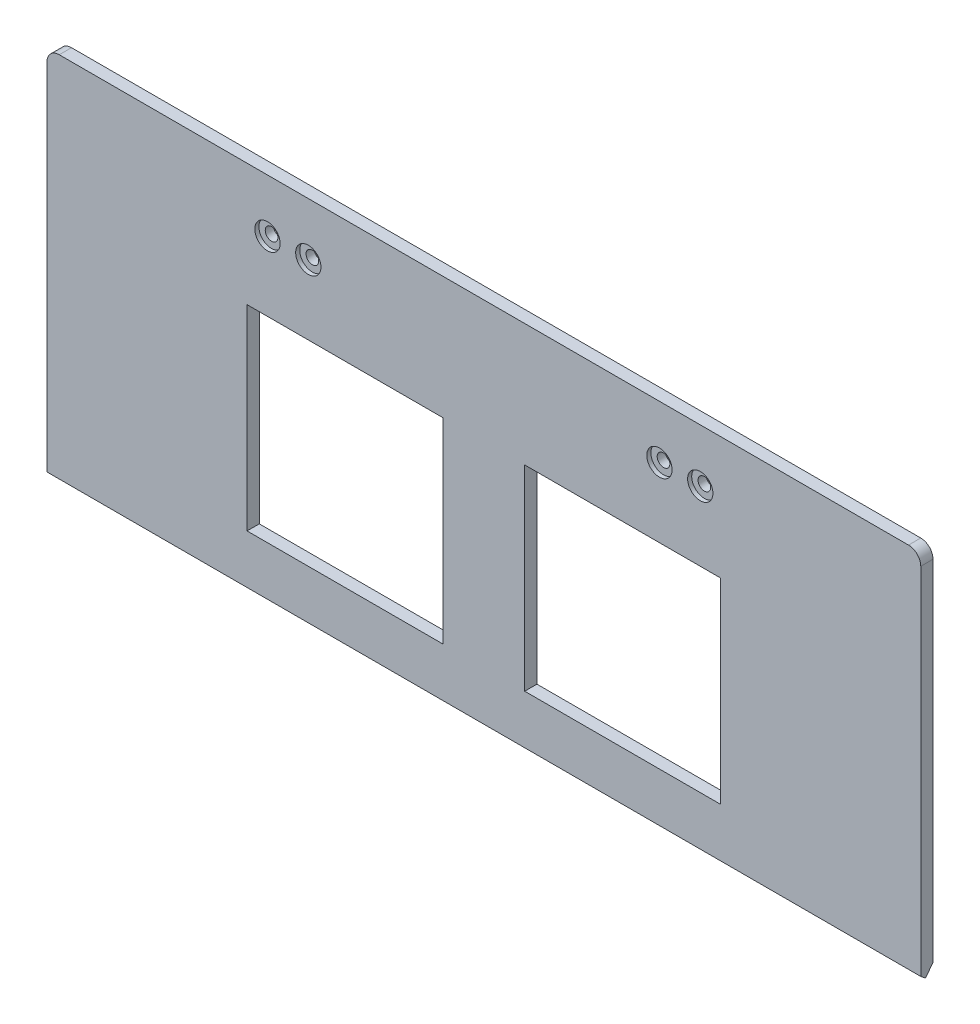
ISO-10303-21;
HEADER;
FILE_DESCRIPTION(('STEP AP214'),'2;1');
FILE_NAME('part.step','',(''),(''),'','','');
FILE_SCHEMA(('AUTOMOTIVE_DESIGN { 1 0 10303 214 1 1 1 1 }'));
ENDSEC;
DATA;
#1=APPLICATION_CONTEXT('core data for automotive mechanical design processes');
#2=APPLICATION_PROTOCOL_DEFINITION('international standard','automotive_design',2000,#1);
#3=PRODUCT_CONTEXT('',#1,'mechanical');
#4=PRODUCT('Part','Part','',(#3));
#5=PRODUCT_RELATED_PRODUCT_CATEGORY('part','',(#4));
#6=PRODUCT_DEFINITION_FORMATION('','',#4);
#7=PRODUCT_DEFINITION_CONTEXT('part definition',#1,'design');
#8=PRODUCT_DEFINITION('design','',#6,#7);
#9=PRODUCT_DEFINITION_SHAPE('','',#8);
#10=(LENGTH_UNIT() NAMED_UNIT(*) SI_UNIT(.MILLI.,.METRE.));
#11=(NAMED_UNIT(*) PLANE_ANGLE_UNIT() SI_UNIT($,.RADIAN.));
#12=(NAMED_UNIT(*) SI_UNIT($,.STERADIAN.) SOLID_ANGLE_UNIT());
#13=UNCERTAINTY_MEASURE_WITH_UNIT(LENGTH_MEASURE(1.E-05),#10,'distance_accuracy_value','');
#14=(GEOMETRIC_REPRESENTATION_CONTEXT(3) GLOBAL_UNCERTAINTY_ASSIGNED_CONTEXT((#13)) GLOBAL_UNIT_ASSIGNED_CONTEXT((#10,
#11,#12)) REPRESENTATION_CONTEXT('',''));
#15=CARTESIAN_POINT('',(0.,0.,0.));
#16=DIRECTION('',(0.,0.,1.));
#17=DIRECTION('',(1.,0.,0.));
#18=AXIS2_PLACEMENT_3D('',#15,#16,#17);
#19=CARTESIAN_POINT('',(104.,42.,-3.));
#20=DIRECTION('',(0.,0.,-1.));
#21=DIRECTION('',(-1.,0.,0.));
#22=AXIS2_PLACEMENT_3D('',#19,#20,#21);
#23=CYLINDRICAL_SURFACE('',#22,3.);
#24=DIRECTION('',(0.,0.,-1.));
#25=VECTOR('',#24,1.);
#26=CARTESIAN_POINT('',(104.,45.,-3.));
#27=LINE('',#26,#25);
#28=CARTESIAN_POINT('',(104.,45.,0.));
#29=VERTEX_POINT('',#28);
#30=CARTESIAN_POINT('',(104.,45.,-3.));
#31=VERTEX_POINT('',#30);
#32=EDGE_CURVE('E373',#29,#31,#27,.T.);
#33=ORIENTED_EDGE('',*,*,#32,.F.);
#34=CARTESIAN_POINT('',(104.,42.,0.));
#35=DIRECTION('',(0.,0.,1.));
#36=DIRECTION('',(1.,0.,0.));
#37=AXIS2_PLACEMENT_3D('',#34,#35,#36);
#38=CIRCLE('',#37,3.);
#39=CARTESIAN_POINT('',(107.,42.,0.));
#40=VERTEX_POINT('',#39);
#41=EDGE_CURVE('E50',#40,#29,#38,.T.);
#42=ORIENTED_EDGE('',*,*,#41,.F.);
#43=DIRECTION('',(0.,0.,-1.));
#44=VECTOR('',#43,1.);
#45=CARTESIAN_POINT('',(107.,42.,-3.));
#46=LINE('',#45,#44);
#47=CARTESIAN_POINT('',(107.,42.,-3.));
#48=VERTEX_POINT('',#47);
#49=EDGE_CURVE('E376',#48,#40,#46,.F.);
#50=ORIENTED_EDGE('',*,*,#49,.F.);
#51=CARTESIAN_POINT('',(104.,42.,-3.));
#52=DIRECTION('',(0.,0.,1.));
#53=DIRECTION('',(1.,0.,0.));
#54=AXIS2_PLACEMENT_3D('',#51,#52,#53);
#55=CIRCLE('',#54,3.);
#56=EDGE_CURVE('E11',#31,#48,#55,.F.);
#57=ORIENTED_EDGE('',*,*,#56,.F.);
#58=EDGE_LOOP('',(#33,#42,#50,#57));
#59=FACE_BOUND('',#58,.T.);
#60=ADVANCED_FACE('F43',(#59),#23,.T.);
#61=CARTESIAN_POINT('',(-104.,42.,-3.));
#62=DIRECTION('',(0.,0.,1.));
#63=DIRECTION('',(1.,0.,0.));
#64=AXIS2_PLACEMENT_3D('',#61,#62,#63);
#65=CYLINDRICAL_SURFACE('',#64,3.);
#66=DIRECTION('',(0.,0.,1.));
#67=VECTOR('',#66,1.);
#68=CARTESIAN_POINT('',(-104.,45.,-3.));
#69=LINE('',#68,#67);
#70=CARTESIAN_POINT('',(-104.,45.,-3.));
#71=VERTEX_POINT('',#70);
#72=CARTESIAN_POINT('',(-104.,45.,0.));
#73=VERTEX_POINT('',#72);
#74=EDGE_CURVE('E330',#71,#73,#69,.T.);
#75=ORIENTED_EDGE('',*,*,#74,.F.);
#76=CARTESIAN_POINT('',(-104.,42.,-3.));
#77=DIRECTION('',(0.,0.,1.));
#78=DIRECTION('',(1.,0.,0.));
#79=AXIS2_PLACEMENT_3D('',#76,#77,#78);
#80=CIRCLE('',#79,3.);
#81=CARTESIAN_POINT('',(-107.,42.,-3.));
#82=VERTEX_POINT('',#81);
#83=EDGE_CURVE('E368',#82,#71,#80,.F.);
#84=ORIENTED_EDGE('',*,*,#83,.F.);
#85=DIRECTION('',(0.,0.,1.));
#86=VECTOR('',#85,1.);
#87=CARTESIAN_POINT('',(-107.,42.,-3.));
#88=LINE('',#87,#86);
#89=CARTESIAN_POINT('',(-107.,42.,0.));
#90=VERTEX_POINT('',#89);
#91=EDGE_CURVE('E365',#90,#82,#88,.F.);
#92=ORIENTED_EDGE('',*,*,#91,.F.);
#93=CARTESIAN_POINT('',(-104.,42.,0.));
#94=DIRECTION('',(0.,0.,1.));
#95=DIRECTION('',(1.,0.,0.));
#96=AXIS2_PLACEMENT_3D('',#93,#94,#95);
#97=CIRCLE('',#96,3.);
#98=EDGE_CURVE('E371',#73,#90,#97,.T.);
#99=ORIENTED_EDGE('',*,*,#98,.F.);
#100=EDGE_LOOP('',(#75,#84,#92,#99));
#101=FACE_BOUND('',#100,.T.);
#102=ADVANCED_FACE('F386',(#101),#65,.T.);
#103=CARTESIAN_POINT('',(-53.,31.9999999999999,0.));
#104=DIRECTION('',(0.,0.,-1.));
#105=DIRECTION('',(-1.,0.,0.));
#106=AXIS2_PLACEMENT_3D('',#103,#104,#105);
#107=CYLINDRICAL_SURFACE('',#106,1.55);
#108=CARTESIAN_POINT('',(-53.,31.9999999999999,-3.));
#109=DIRECTION('',(0.,0.,-1.));
#110=DIRECTION('',(-1.,0.,0.));
#111=AXIS2_PLACEMENT_3D('',#108,#109,#110);
#112=CIRCLE('',#111,1.55);
#113=CARTESIAN_POINT('',(-54.55,31.9999999999999,-3.));
#114=VERTEX_POINT('',#113);
#115=EDGE_CURVE('E318',#114,#114,#112,.T.);
#116=ORIENTED_EDGE('',*,*,#115,.T.);
#117=EDGE_LOOP('',(#116));
#118=FACE_BOUND('',#117,.T.);
#119=CARTESIAN_POINT('',(-53.,31.9999999999999,-1.));
#120=DIRECTION('',(0.,0.,1.));
#121=DIRECTION('',(1.,0.,0.));
#122=AXIS2_PLACEMENT_3D('',#119,#120,#121);
#123=CIRCLE('',#122,1.55);
#124=CARTESIAN_POINT('',(-51.45,31.9999999999999,-1.));
#125=VERTEX_POINT('',#124);
#126=EDGE_CURVE('E321',#125,#125,#123,.F.);
#127=ORIENTED_EDGE('',*,*,#126,.F.);
#128=EDGE_LOOP('',(#127));
#129=FACE_BOUND('',#128,.T.);
#130=ADVANCED_FACE('F454',(#118,#129),#107,.F.);
#131=CARTESIAN_POINT('',(-43.,31.9999999999999,0.));
#132=DIRECTION('',(0.,0.,-1.));
#133=DIRECTION('',(-1.,0.,0.));
#134=AXIS2_PLACEMENT_3D('',#131,#132,#133);
#135=CYLINDRICAL_SURFACE('',#134,1.55);
#136=CARTESIAN_POINT('',(-43.,31.9999999999999,-3.));
#137=DIRECTION('',(0.,0.,-1.));
#138=DIRECTION('',(-1.,0.,0.));
#139=AXIS2_PLACEMENT_3D('',#136,#137,#138);
#140=CIRCLE('',#139,1.55);
#141=CARTESIAN_POINT('',(-44.55,31.9999999999999,-3.));
#142=VERTEX_POINT('',#141);
#143=EDGE_CURVE('E315',#142,#142,#140,.T.);
#144=ORIENTED_EDGE('',*,*,#143,.T.);
#145=EDGE_LOOP('',(#144));
#146=FACE_BOUND('',#145,.T.);
#147=CARTESIAN_POINT('',(-43.,31.9999999999999,-1.));
#148=DIRECTION('',(0.,0.,1.));
#149=DIRECTION('',(1.,0.,0.));
#150=AXIS2_PLACEMENT_3D('',#147,#148,#149);
#151=CIRCLE('',#150,1.55);
#152=CARTESIAN_POINT('',(-41.45,31.9999999999999,-1.));
#153=VERTEX_POINT('',#152);
#154=EDGE_CURVE('E343',#153,#153,#151,.F.);
#155=ORIENTED_EDGE('',*,*,#154,.F.);
#156=EDGE_LOOP('',(#155));
#157=FACE_BOUND('',#156,.T.);
#158=ADVANCED_FACE('F459',(#146,#157),#135,.F.);
#159=CARTESIAN_POINT('',(43.,31.9999999999999,0.));
#160=DIRECTION('',(0.,0.,-1.));
#161=DIRECTION('',(-1.,0.,0.));
#162=AXIS2_PLACEMENT_3D('',#159,#160,#161);
#163=CYLINDRICAL_SURFACE('',#162,1.55);
#164=CARTESIAN_POINT('',(43.,31.9999999999999,-3.));
#165=DIRECTION('',(0.,0.,-1.));
#166=DIRECTION('',(-1.,0.,0.));
#167=AXIS2_PLACEMENT_3D('',#164,#165,#166);
#168=CIRCLE('',#167,1.55);
#169=CARTESIAN_POINT('',(41.45,31.9999999999999,-3.));
#170=VERTEX_POINT('',#169);
#171=EDGE_CURVE('E312',#170,#170,#168,.T.);
#172=ORIENTED_EDGE('',*,*,#171,.T.);
#173=EDGE_LOOP('',(#172));
#174=FACE_BOUND('',#173,.T.);
#175=CARTESIAN_POINT('',(43.,31.9999999999999,-1.));
#176=DIRECTION('',(0.,0.,1.));
#177=DIRECTION('',(1.,0.,0.));
#178=AXIS2_PLACEMENT_3D('',#175,#176,#177);
#179=CIRCLE('',#178,1.55);
#180=CARTESIAN_POINT('',(44.55,31.9999999999999,-1.));
#181=VERTEX_POINT('',#180);
#182=EDGE_CURVE('E340',#181,#181,#179,.F.);
#183=ORIENTED_EDGE('',*,*,#182,.F.);
#184=EDGE_LOOP('',(#183));
#185=FACE_BOUND('',#184,.T.);
#186=ADVANCED_FACE('F479',(#174,#185),#163,.F.);
#187=CARTESIAN_POINT('',(53.,31.9999999999999,0.));
#188=DIRECTION('',(0.,0.,-1.));
#189=DIRECTION('',(-1.,0.,0.));
#190=AXIS2_PLACEMENT_3D('',#187,#188,#189);
#191=CYLINDRICAL_SURFACE('',#190,1.55);
#192=CARTESIAN_POINT('',(53.,31.9999999999999,-3.));
#193=DIRECTION('',(0.,0.,-1.));
#194=DIRECTION('',(-1.,0.,0.));
#195=AXIS2_PLACEMENT_3D('',#192,#193,#194);
#196=CIRCLE('',#195,1.55);
#197=CARTESIAN_POINT('',(51.45,31.9999999999999,-3.));
#198=VERTEX_POINT('',#197);
#199=EDGE_CURVE('E308',#198,#198,#196,.T.);
#200=ORIENTED_EDGE('',*,*,#199,.T.);
#201=EDGE_LOOP('',(#200));
#202=FACE_BOUND('',#201,.T.);
#203=CARTESIAN_POINT('',(53.,31.9999999999999,-1.));
#204=DIRECTION('',(0.,0.,1.));
#205=DIRECTION('',(1.,0.,0.));
#206=AXIS2_PLACEMENT_3D('',#203,#204,#205);
#207=CIRCLE('',#206,1.55);
#208=CARTESIAN_POINT('',(54.55,31.9999999999999,-1.));
#209=VERTEX_POINT('',#208);
#210=EDGE_CURVE('E287',#209,#209,#207,.F.);
#211=ORIENTED_EDGE('',*,*,#210,.F.);
#212=EDGE_LOOP('',(#211));
#213=FACE_BOUND('',#212,.T.);
#214=ADVANCED_FACE('F465',(#202,#213),#191,.F.);
#215=CARTESIAN_POINT('',(107.,45.,-3.));
#216=DIRECTION('',(1.,0.,0.));
#217=DIRECTION('',(0.,0.,-1.));
#218=AXIS2_PLACEMENT_3D('',#215,#216,#217);
#219=PLANE('',#218);
#220=DIRECTION('',(0.,1.,0.));
#221=VECTOR('',#220,1.);
#222=CARTESIAN_POINT('',(107.,45.,-3.));
#223=LINE('',#222,#221);
#224=CARTESIAN_POINT('',(107.,-43.5406290526665,-2.99999999999999));
#225=VERTEX_POINT('',#224);
#226=EDGE_CURVE('E322',#225,#48,#223,.T.);
#227=ORIENTED_EDGE('',*,*,#226,.T.);
#228=ORIENTED_EDGE('',*,*,#49,.T.);
#229=DIRECTION('',(0.,1.,0.));
#230=VECTOR('',#229,1.);
#231=CARTESIAN_POINT('',(107.,45.,0.));
#232=LINE('',#231,#230);
#233=CARTESIAN_POINT('',(107.,-45.,0.));
#234=VERTEX_POINT('',#233);
#235=EDGE_CURVE('E311',#234,#40,#232,.T.);
#236=ORIENTED_EDGE('',*,*,#235,.F.);
#237=DIRECTION('',(0.,-0.615661475325662,-0.788010753606719));
#238=VECTOR('',#237,1.);
#239=CARTESIAN_POINT('',(107.,-45.,0.));
#240=LINE('',#239,#238);
#241=CARTESIAN_POINT('',(107.,-45.9022850087283,-1.15487214677498));
#242=VERTEX_POINT('',#241);
#243=EDGE_CURVE('E190',#234,#242,#240,.T.);
#244=ORIENTED_EDGE('',*,*,#243,.T.);
#245=DIRECTION('',(0.,0.788010753606719,-0.615661475325662));
#246=VECTOR('',#245,1.);
#247=CARTESIAN_POINT('',(107.,-55.5989985040474,6.42103073147168));
#248=LINE('',#247,#246);
#249=EDGE_CURVE('E405',#242,#225,#248,.T.);
#250=ORIENTED_EDGE('',*,*,#249,.T.);
#251=EDGE_LOOP('',(#227,#228,#236,#244,#250));
#252=FACE_BOUND('',#251,.T.);
#253=ADVANCED_FACE('F463',(#252),#219,.T.);
#254=CARTESIAN_POINT('',(-107.,45.,-3.));
#255=DIRECTION('',(-1.,0.,0.));
#256=DIRECTION('',(0.,0.,1.));
#257=AXIS2_PLACEMENT_3D('',#254,#255,#256);
#258=PLANE('',#257);
#259=DIRECTION('',(0.,-1.,0.));
#260=VECTOR('',#259,1.);
#261=CARTESIAN_POINT('',(-107.,45.,0.));
#262=LINE('',#261,#260);
#263=CARTESIAN_POINT('',(-107.,-45.,0.));
#264=VERTEX_POINT('',#263);
#265=EDGE_CURVE('E335',#90,#264,#262,.T.);
#266=ORIENTED_EDGE('',*,*,#265,.F.);
#267=ORIENTED_EDGE('',*,*,#91,.T.);
#268=DIRECTION('',(0.,-1.,0.));
#269=VECTOR('',#268,1.);
#270=CARTESIAN_POINT('',(-107.,45.,-3.));
#271=LINE('',#270,#269);
#272=CARTESIAN_POINT('',(-107.,-43.5406290526665,-3.));
#273=VERTEX_POINT('',#272);
#274=EDGE_CURVE('E328',#82,#273,#271,.T.);
#275=ORIENTED_EDGE('',*,*,#274,.T.);
#276=DIRECTION('',(0.,0.788010753606719,-0.615661475325662));
#277=VECTOR('',#276,1.);
#278=CARTESIAN_POINT('',(-107.,-55.5989985040474,6.42103073147168));
#279=LINE('',#278,#277);
#280=CARTESIAN_POINT('',(-107.,-45.9022850087283,-1.15487214677498));
#281=VERTEX_POINT('',#280);
#282=EDGE_CURVE('E181',#281,#273,#279,.T.);
#283=ORIENTED_EDGE('',*,*,#282,.F.);
#284=DIRECTION('',(0.,-0.615661475325662,-0.788010753606719));
#285=VECTOR('',#284,1.);
#286=CARTESIAN_POINT('',(-107.,-45.,0.));
#287=LINE('',#286,#285);
#288=EDGE_CURVE('E211',#264,#281,#287,.T.);
#289=ORIENTED_EDGE('',*,*,#288,.F.);
#290=EDGE_LOOP('',(#266,#267,#275,#283,#289));
#291=FACE_BOUND('',#290,.T.);
#292=ADVANCED_FACE('F397',(#291),#258,.T.);
#293=CARTESIAN_POINT('',(-107.,45.,-3.));
#294=DIRECTION('',(0.,1.,0.));
#295=DIRECTION('',(0.,0.,1.));
#296=AXIS2_PLACEMENT_3D('',#293,#294,#295);
#297=PLANE('',#296);
#298=DIRECTION('',(-1.,0.,0.));
#299=VECTOR('',#298,1.);
#300=CARTESIAN_POINT('',(-107.,45.,0.));
#301=LINE('',#300,#299);
#302=EDGE_CURVE('E333',#29,#73,#301,.T.);
#303=ORIENTED_EDGE('',*,*,#302,.F.);
#304=ORIENTED_EDGE('',*,*,#32,.T.);
#305=DIRECTION('',(-1.,0.,0.));
#306=VECTOR('',#305,1.);
#307=CARTESIAN_POINT('',(-107.,45.,-3.));
#308=LINE('',#307,#306);
#309=EDGE_CURVE('E325',#31,#71,#308,.T.);
#310=ORIENTED_EDGE('',*,*,#309,.T.);
#311=ORIENTED_EDGE('',*,*,#74,.T.);
#312=EDGE_LOOP('',(#303,#304,#310,#311));
#313=FACE_BOUND('',#312,.T.);
#314=ADVANCED_FACE('F383',(#313),#297,.T.);
#315=CARTESIAN_POINT('',(0.,0.,-3.));
#316=DIRECTION('',(0.,0.,1.));
#317=DIRECTION('',(1.,0.,0.));
#318=AXIS2_PLACEMENT_3D('',#315,#316,#317);
#319=PLANE('',#318);
#320=DIRECTION('',(-1.,0.,0.));
#321=VECTOR('',#320,1.);
#322=CARTESIAN_POINT('',(58.,-33.,-3.));
#323=LINE('',#322,#321);
#324=CARTESIAN_POINT('',(58.,-33.,-3.));
#325=VERTEX_POINT('',#324);
#326=CARTESIAN_POINT('',(9.99999999999997,-33.,-3.));
#327=VERTEX_POINT('',#326);
#328=EDGE_CURVE('E236',#325,#327,#323,.T.);
#329=ORIENTED_EDGE('',*,*,#328,.F.);
#330=DIRECTION('',(0.,-1.,0.));
#331=VECTOR('',#330,1.);
#332=CARTESIAN_POINT('',(58.,15.,-3.));
#333=LINE('',#332,#331);
#334=CARTESIAN_POINT('',(58.,15.,-3.));
#335=VERTEX_POINT('',#334);
#336=EDGE_CURVE('E234',#335,#325,#333,.T.);
#337=ORIENTED_EDGE('',*,*,#336,.F.);
#338=DIRECTION('',(1.,0.,0.));
#339=VECTOR('',#338,1.);
#340=CARTESIAN_POINT('',(58.,15.,-3.));
#341=LINE('',#340,#339);
#342=CARTESIAN_POINT('',(9.99999999999998,15.,-3.));
#343=VERTEX_POINT('',#342);
#344=EDGE_CURVE('E224',#343,#335,#341,.T.);
#345=ORIENTED_EDGE('',*,*,#344,.F.);
#346=DIRECTION('',(0.,1.,0.));
#347=VECTOR('',#346,1.);
#348=CARTESIAN_POINT('',(9.99999999999998,15.,-3.));
#349=LINE('',#348,#347);
#350=EDGE_CURVE('E240',#327,#343,#349,.T.);
#351=ORIENTED_EDGE('',*,*,#350,.F.);
#352=EDGE_LOOP('',(#329,#337,#345,#351));
#353=FACE_BOUND('',#352,.T.);
#354=DIRECTION('',(-1.,0.,0.));
#355=VECTOR('',#354,1.);
#356=CARTESIAN_POINT('',(-10.,-33.,-3.));
#357=LINE('',#356,#355);
#358=CARTESIAN_POINT('',(-10.,-33.,-3.));
#359=VERTEX_POINT('',#358);
#360=CARTESIAN_POINT('',(-58.,-33.,-3.));
#361=VERTEX_POINT('',#360);
#362=EDGE_CURVE('E270',#359,#361,#357,.T.);
#363=ORIENTED_EDGE('',*,*,#362,.F.);
#364=DIRECTION('',(0.,-1.,0.));
#365=VECTOR('',#364,1.);
#366=CARTESIAN_POINT('',(-9.99999999999999,15.,-3.));
#367=LINE('',#366,#365);
#368=CARTESIAN_POINT('',(-9.99999999999999,15.,-3.));
#369=VERTEX_POINT('',#368);
#370=EDGE_CURVE('E237',#369,#359,#367,.T.);
#371=ORIENTED_EDGE('',*,*,#370,.F.);
#372=DIRECTION('',(1.,0.,0.));
#373=VECTOR('',#372,1.);
#374=CARTESIAN_POINT('',(-9.99999999999999,15.,-3.));
#375=LINE('',#374,#373);
#376=CARTESIAN_POINT('',(-58.,15.,-3.));
#377=VERTEX_POINT('',#376);
#378=EDGE_CURVE('E263',#377,#369,#375,.T.);
#379=ORIENTED_EDGE('',*,*,#378,.F.);
#380=DIRECTION('',(0.,1.,0.));
#381=VECTOR('',#380,1.);
#382=CARTESIAN_POINT('',(-58.,15.,-3.));
#383=LINE('',#382,#381);
#384=EDGE_CURVE('E266',#361,#377,#383,.T.);
#385=ORIENTED_EDGE('',*,*,#384,.F.);
#386=EDGE_LOOP('',(#363,#371,#379,#385));
#387=FACE_BOUND('',#386,.T.);
#388=ORIENTED_EDGE('',*,*,#199,.F.);
#389=EDGE_LOOP('',(#388));
#390=FACE_BOUND('',#389,.T.);
#391=ORIENTED_EDGE('',*,*,#171,.F.);
#392=EDGE_LOOP('',(#391));
#393=FACE_BOUND('',#392,.T.);
#394=ORIENTED_EDGE('',*,*,#143,.F.);
#395=EDGE_LOOP('',(#394));
#396=FACE_BOUND('',#395,.T.);
#397=ORIENTED_EDGE('',*,*,#115,.F.);
#398=EDGE_LOOP('',(#397));
#399=FACE_BOUND('',#398,.T.);
#400=ORIENTED_EDGE('',*,*,#309,.F.);
#401=ORIENTED_EDGE('',*,*,#56,.T.);
#402=ORIENTED_EDGE('',*,*,#226,.F.);
#403=DIRECTION('',(1.,0.,0.));
#404=VECTOR('',#403,1.);
#405=CARTESIAN_POINT('',(107.,-43.5406290526665,-2.99999999999999));
#406=LINE('',#405,#404);
#407=CARTESIAN_POINT('',(72.,-43.5406290526665,-2.99999999999999));
#408=VERTEX_POINT('',#407);
#409=EDGE_CURVE('E205',#408,#225,#406,.T.);
#410=ORIENTED_EDGE('',*,*,#409,.F.);
#411=DIRECTION('',(1.,0.,0.));
#412=VECTOR('',#411,1.);
#413=CARTESIAN_POINT('',(-107.,-43.5406290526665,-3.));
#414=LINE('',#413,#412);
#415=CARTESIAN_POINT('',(-72.,-43.5406290526665,-2.99999999999999));
#416=VERTEX_POINT('',#415);
#417=EDGE_CURVE('E191',#416,#408,#414,.T.);
#418=ORIENTED_EDGE('',*,*,#417,.F.);
#419=EDGE_CURVE('E185',#273,#416,#414,.T.);
#420=ORIENTED_EDGE('',*,*,#419,.F.);
#421=ORIENTED_EDGE('',*,*,#274,.F.);
#422=ORIENTED_EDGE('',*,*,#83,.T.);
#423=EDGE_LOOP('',(#400,#401,#402,#410,#418,#420,#421,#422));
#424=FACE_BOUND('',#423,.T.);
#425=ADVANCED_FACE('F204',(#353,#387,#390,#393,#396,#399,#424),#319,.F.);
#426=CARTESIAN_POINT('',(0.,0.,0.));
#427=DIRECTION('',(0.,0.,1.));
#428=DIRECTION('',(1.,0.,0.));
#429=AXIS2_PLACEMENT_3D('',#426,#427,#428);
#430=PLANE('',#429);
#431=DIRECTION('',(0.,-1.,0.));
#432=VECTOR('',#431,1.);
#433=CARTESIAN_POINT('',(58.,15.,0.));
#434=LINE('',#433,#432);
#435=CARTESIAN_POINT('',(58.,15.,0.));
#436=VERTEX_POINT('',#435);
#437=CARTESIAN_POINT('',(58.,-33.,0.));
#438=VERTEX_POINT('',#437);
#439=EDGE_CURVE('E220',#436,#438,#434,.T.);
#440=ORIENTED_EDGE('',*,*,#439,.T.);
#441=DIRECTION('',(-1.,0.,0.));
#442=VECTOR('',#441,1.);
#443=CARTESIAN_POINT('',(58.,-33.,0.));
#444=LINE('',#443,#442);
#445=CARTESIAN_POINT('',(9.99999999999997,-33.,0.));
#446=VERTEX_POINT('',#445);
#447=EDGE_CURVE('E223',#438,#446,#444,.T.);
#448=ORIENTED_EDGE('',*,*,#447,.T.);
#449=DIRECTION('',(0.,1.,0.));
#450=VECTOR('',#449,1.);
#451=CARTESIAN_POINT('',(9.99999999999998,15.,0.));
#452=LINE('',#451,#450);
#453=CARTESIAN_POINT('',(9.99999999999998,15.,0.));
#454=VERTEX_POINT('',#453);
#455=EDGE_CURVE('E227',#446,#454,#452,.T.);
#456=ORIENTED_EDGE('',*,*,#455,.T.);
#457=DIRECTION('',(1.,0.,0.));
#458=VECTOR('',#457,1.);
#459=CARTESIAN_POINT('',(58.,15.,0.));
#460=LINE('',#459,#458);
#461=EDGE_CURVE('E230',#454,#436,#460,.T.);
#462=ORIENTED_EDGE('',*,*,#461,.T.);
#463=EDGE_LOOP('',(#440,#448,#456,#462));
#464=FACE_BOUND('',#463,.T.);
#465=DIRECTION('',(0.,-1.,0.));
#466=VECTOR('',#465,1.);
#467=CARTESIAN_POINT('',(-9.99999999999999,15.,0.));
#468=LINE('',#467,#466);
#469=CARTESIAN_POINT('',(-9.99999999999999,15.,0.));
#470=VERTEX_POINT('',#469);
#471=CARTESIAN_POINT('',(-10.,-33.,0.));
#472=VERTEX_POINT('',#471);
#473=EDGE_CURVE('E267',#470,#472,#468,.T.);
#474=ORIENTED_EDGE('',*,*,#473,.T.);
#475=DIRECTION('',(-1.,0.,0.));
#476=VECTOR('',#475,1.);
#477=CARTESIAN_POINT('',(-10.,-33.,0.));
#478=LINE('',#477,#476);
#479=CARTESIAN_POINT('',(-58.,-33.,0.));
#480=VERTEX_POINT('',#479);
#481=EDGE_CURVE('E279',#472,#480,#478,.T.);
#482=ORIENTED_EDGE('',*,*,#481,.T.);
#483=DIRECTION('',(0.,1.,0.));
#484=VECTOR('',#483,1.);
#485=CARTESIAN_POINT('',(-58.,15.,0.));
#486=LINE('',#485,#484);
#487=CARTESIAN_POINT('',(-58.,15.,0.));
#488=VERTEX_POINT('',#487);
#489=EDGE_CURVE('E276',#480,#488,#486,.T.);
#490=ORIENTED_EDGE('',*,*,#489,.T.);
#491=DIRECTION('',(1.,0.,0.));
#492=VECTOR('',#491,1.);
#493=CARTESIAN_POINT('',(-9.99999999999999,15.,0.));
#494=LINE('',#493,#492);
#495=EDGE_CURVE('E257',#488,#470,#494,.T.);
#496=ORIENTED_EDGE('',*,*,#495,.T.);
#497=EDGE_LOOP('',(#474,#482,#490,#496));
#498=FACE_BOUND('',#497,.T.);
#499=CARTESIAN_POINT('',(53.,31.9999999999999,0.));
#500=DIRECTION('',(0.,0.,1.));
#501=DIRECTION('',(1.,0.,0.));
#502=AXIS2_PLACEMENT_3D('',#499,#500,#501);
#503=CIRCLE('',#502,3.1);
#504=CARTESIAN_POINT('',(56.1,31.9999999999999,0.));
#505=VERTEX_POINT('',#504);
#506=EDGE_CURVE('E288',#505,#505,#503,.T.);
#507=ORIENTED_EDGE('',*,*,#506,.F.);
#508=EDGE_LOOP('',(#507));
#509=FACE_BOUND('',#508,.T.);
#510=CARTESIAN_POINT('',(43.,31.9999999999999,0.));
#511=DIRECTION('',(0.,0.,1.));
#512=DIRECTION('',(1.,0.,0.));
#513=AXIS2_PLACEMENT_3D('',#510,#511,#512);
#514=CIRCLE('',#513,3.09999999999999);
#515=CARTESIAN_POINT('',(46.1,31.9999999999999,0.));
#516=VERTEX_POINT('',#515);
#517=EDGE_CURVE('E291',#516,#516,#514,.T.);
#518=ORIENTED_EDGE('',*,*,#517,.F.);
#519=EDGE_LOOP('',(#518));
#520=FACE_BOUND('',#519,.T.);
#521=CARTESIAN_POINT('',(-43.,31.9999999999999,0.));
#522=DIRECTION('',(0.,0.,1.));
#523=DIRECTION('',(1.,0.,0.));
#524=AXIS2_PLACEMENT_3D('',#521,#522,#523);
#525=CIRCLE('',#524,3.1);
#526=CARTESIAN_POINT('',(-39.9,31.9999999999999,0.));
#527=VERTEX_POINT('',#526);
#528=EDGE_CURVE('E297',#527,#527,#525,.T.);
#529=ORIENTED_EDGE('',*,*,#528,.F.);
#530=EDGE_LOOP('',(#529));
#531=FACE_BOUND('',#530,.T.);
#532=CARTESIAN_POINT('',(-53.,31.9999999999999,0.));
#533=DIRECTION('',(0.,0.,1.));
#534=DIRECTION('',(1.,0.,0.));
#535=AXIS2_PLACEMENT_3D('',#532,#533,#534);
#536=CIRCLE('',#535,3.09999999999999);
#537=CARTESIAN_POINT('',(-49.9,31.9999999999999,0.));
#538=VERTEX_POINT('',#537);
#539=EDGE_CURVE('E303',#538,#538,#536,.T.);
#540=ORIENTED_EDGE('',*,*,#539,.F.);
#541=EDGE_LOOP('',(#540));
#542=FACE_BOUND('',#541,.T.);
#543=ORIENTED_EDGE('',*,*,#235,.T.);
#544=ORIENTED_EDGE('',*,*,#41,.T.);
#545=ORIENTED_EDGE('',*,*,#302,.T.);
#546=ORIENTED_EDGE('',*,*,#98,.T.);
#547=ORIENTED_EDGE('',*,*,#265,.T.);
#548=DIRECTION('',(1.,0.,0.));
#549=VECTOR('',#548,1.);
#550=CARTESIAN_POINT('',(-107.,-45.,0.));
#551=LINE('',#550,#549);
#552=EDGE_CURVE('E326',#264,#234,#551,.T.);
#553=ORIENTED_EDGE('',*,*,#552,.T.);
#554=EDGE_LOOP('',(#543,#544,#545,#546,#547,#553));
#555=FACE_BOUND('',#554,.T.);
#556=ADVANCED_FACE('F378',(#464,#498,#509,#520,#531,#542,#555),#430,.T.);
#557=CARTESIAN_POINT('',(53.,31.9999999999999,-1.));
#558=DIRECTION('',(0.,0.,1.));
#559=DIRECTION('',(1.,0.,0.));
#560=AXIS2_PLACEMENT_3D('',#557,#558,#559);
#561=PLANE('',#560);
#562=CARTESIAN_POINT('',(53.,31.9999999999999,-1.));
#563=DIRECTION('',(0.,0.,1.));
#564=DIRECTION('',(1.,0.,0.));
#565=AXIS2_PLACEMENT_3D('',#562,#563,#564);
#566=CIRCLE('',#565,3.1);
#567=CARTESIAN_POINT('',(56.1,31.9999999999999,-1.));
#568=VERTEX_POINT('',#567);
#569=EDGE_CURVE('E284',#568,#568,#566,.T.);
#570=ORIENTED_EDGE('',*,*,#569,.T.);
#571=EDGE_LOOP('',(#570));
#572=FACE_BOUND('',#571,.T.);
#573=ORIENTED_EDGE('',*,*,#210,.T.);
#574=EDGE_LOOP('',(#573));
#575=FACE_BOUND('',#574,.T.);
#576=ADVANCED_FACE('F472',(#572,#575),#561,.T.);
#577=CARTESIAN_POINT('',(53.,31.9999999999999,-1.));
#578=DIRECTION('',(0.,0.,1.));
#579=DIRECTION('',(1.,0.,0.));
#580=AXIS2_PLACEMENT_3D('',#577,#578,#579);
#581=CYLINDRICAL_SURFACE('',#580,3.1);
#582=ORIENTED_EDGE('',*,*,#569,.F.);
#583=EDGE_LOOP('',(#582));
#584=FACE_BOUND('',#583,.T.);
#585=ORIENTED_EDGE('',*,*,#506,.T.);
#586=EDGE_LOOP('',(#585));
#587=FACE_BOUND('',#586,.T.);
#588=ADVANCED_FACE('F508',(#584,#587),#581,.F.);
#589=CARTESIAN_POINT('',(43.,31.9999999999999,-1.));
#590=DIRECTION('',(0.,0.,1.));
#591=DIRECTION('',(1.,0.,0.));
#592=AXIS2_PLACEMENT_3D('',#589,#590,#591);
#593=PLANE('',#592);
#594=CARTESIAN_POINT('',(43.,31.9999999999999,-1.));
#595=DIRECTION('',(0.,0.,1.));
#596=DIRECTION('',(1.,0.,0.));
#597=AXIS2_PLACEMENT_3D('',#594,#595,#596);
#598=CIRCLE('',#597,3.09999999999999);
#599=CARTESIAN_POINT('',(46.1,31.9999999999999,-1.));
#600=VERTEX_POINT('',#599);
#601=EDGE_CURVE('E294',#600,#600,#598,.T.);
#602=ORIENTED_EDGE('',*,*,#601,.T.);
#603=EDGE_LOOP('',(#602));
#604=FACE_BOUND('',#603,.T.);
#605=ORIENTED_EDGE('',*,*,#182,.T.);
#606=EDGE_LOOP('',(#605));
#607=FACE_BOUND('',#606,.T.);
#608=ADVANCED_FACE('F505',(#604,#607),#593,.T.);
#609=CARTESIAN_POINT('',(43.,31.9999999999999,-1.));
#610=DIRECTION('',(0.,0.,1.));
#611=DIRECTION('',(1.,0.,0.));
#612=AXIS2_PLACEMENT_3D('',#609,#610,#611);
#613=CYLINDRICAL_SURFACE('',#612,3.09999999999999);
#614=ORIENTED_EDGE('',*,*,#601,.F.);
#615=EDGE_LOOP('',(#614));
#616=FACE_BOUND('',#615,.T.);
#617=ORIENTED_EDGE('',*,*,#517,.T.);
#618=EDGE_LOOP('',(#617));
#619=FACE_BOUND('',#618,.T.);
#620=ADVANCED_FACE('F500',(#616,#619),#613,.F.);
#621=CARTESIAN_POINT('',(-43.,31.9999999999999,-1.));
#622=DIRECTION('',(0.,0.,1.));
#623=DIRECTION('',(1.,0.,0.));
#624=AXIS2_PLACEMENT_3D('',#621,#622,#623);
#625=PLANE('',#624);
#626=CARTESIAN_POINT('',(-43.,31.9999999999999,-1.));
#627=DIRECTION('',(0.,0.,1.));
#628=DIRECTION('',(1.,0.,0.));
#629=AXIS2_PLACEMENT_3D('',#626,#627,#628);
#630=CIRCLE('',#629,3.1);
#631=CARTESIAN_POINT('',(-39.9,31.9999999999999,-1.));
#632=VERTEX_POINT('',#631);
#633=EDGE_CURVE('E300',#632,#632,#630,.T.);
#634=ORIENTED_EDGE('',*,*,#633,.T.);
#635=EDGE_LOOP('',(#634));
#636=FACE_BOUND('',#635,.T.);
#637=ORIENTED_EDGE('',*,*,#154,.T.);
#638=EDGE_LOOP('',(#637));
#639=FACE_BOUND('',#638,.T.);
#640=ADVANCED_FACE('F497',(#636,#639),#625,.T.);
#641=CARTESIAN_POINT('',(-43.,31.9999999999999,-1.));
#642=DIRECTION('',(0.,0.,1.));
#643=DIRECTION('',(1.,0.,0.));
#644=AXIS2_PLACEMENT_3D('',#641,#642,#643);
#645=CYLINDRICAL_SURFACE('',#644,3.1);
#646=ORIENTED_EDGE('',*,*,#633,.F.);
#647=EDGE_LOOP('',(#646));
#648=FACE_BOUND('',#647,.T.);
#649=ORIENTED_EDGE('',*,*,#528,.T.);
#650=EDGE_LOOP('',(#649));
#651=FACE_BOUND('',#650,.T.);
#652=ADVANCED_FACE('F491',(#648,#651),#645,.F.);
#653=CARTESIAN_POINT('',(-53.,31.9999999999999,-1.));
#654=DIRECTION('',(0.,0.,1.));
#655=DIRECTION('',(1.,0.,0.));
#656=AXIS2_PLACEMENT_3D('',#653,#654,#655);
#657=PLANE('',#656);
#658=CARTESIAN_POINT('',(-53.,31.9999999999999,-1.));
#659=DIRECTION('',(0.,0.,1.));
#660=DIRECTION('',(1.,0.,0.));
#661=AXIS2_PLACEMENT_3D('',#658,#659,#660);
#662=CIRCLE('',#661,3.09999999999999);
#663=CARTESIAN_POINT('',(-49.9,31.9999999999999,-1.));
#664=VERTEX_POINT('',#663);
#665=EDGE_CURVE('E247',#664,#664,#662,.T.);
#666=ORIENTED_EDGE('',*,*,#665,.T.);
#667=EDGE_LOOP('',(#666));
#668=FACE_BOUND('',#667,.T.);
#669=ORIENTED_EDGE('',*,*,#126,.T.);
#670=EDGE_LOOP('',(#669));
#671=FACE_BOUND('',#670,.T.);
#672=ADVANCED_FACE('F487',(#668,#671),#657,.T.);
#673=CARTESIAN_POINT('',(-53.,31.9999999999999,-1.));
#674=DIRECTION('',(0.,0.,1.));
#675=DIRECTION('',(1.,0.,0.));
#676=AXIS2_PLACEMENT_3D('',#673,#674,#675);
#677=CYLINDRICAL_SURFACE('',#676,3.09999999999999);
#678=ORIENTED_EDGE('',*,*,#665,.F.);
#679=EDGE_LOOP('',(#678));
#680=FACE_BOUND('',#679,.T.);
#681=ORIENTED_EDGE('',*,*,#539,.T.);
#682=EDGE_LOOP('',(#681));
#683=FACE_BOUND('',#682,.T.);
#684=ADVANCED_FACE('F490',(#680,#683),#677,.F.);
#685=CARTESIAN_POINT('',(-9.99999999999999,15.,0.));
#686=DIRECTION('',(1.,0.,0.));
#687=DIRECTION('',(0.,1.,0.));
#688=AXIS2_PLACEMENT_3D('',#685,#686,#687);
#689=PLANE('',#688);
#690=ORIENTED_EDGE('',*,*,#370,.T.);
#691=DIRECTION('',(0.,0.,-1.));
#692=VECTOR('',#691,1.);
#693=CARTESIAN_POINT('',(-10.,-33.,0.));
#694=LINE('',#693,#692);
#695=EDGE_CURVE('E254',#472,#359,#694,.T.);
#696=ORIENTED_EDGE('',*,*,#695,.F.);
#697=ORIENTED_EDGE('',*,*,#473,.F.);
#698=DIRECTION('',(0.,0.,-1.));
#699=VECTOR('',#698,1.);
#700=CARTESIAN_POINT('',(-9.99999999999999,15.,0.));
#701=LINE('',#700,#699);
#702=EDGE_CURVE('E219',#470,#369,#701,.T.);
#703=ORIENTED_EDGE('',*,*,#702,.T.);
#704=EDGE_LOOP('',(#690,#696,#697,#703));
#705=FACE_BOUND('',#704,.T.);
#706=ADVANCED_FACE('F495',(#705),#689,.F.);
#707=CARTESIAN_POINT('',(-9.99999999999999,15.,0.));
#708=DIRECTION('',(0.,1.,0.));
#709=DIRECTION('',(0.,0.,1.));
#710=AXIS2_PLACEMENT_3D('',#707,#708,#709);
#711=PLANE('',#710);
#712=ORIENTED_EDGE('',*,*,#378,.T.);
#713=ORIENTED_EDGE('',*,*,#702,.F.);
#714=ORIENTED_EDGE('',*,*,#495,.F.);
#715=DIRECTION('',(0.,0.,-1.));
#716=VECTOR('',#715,1.);
#717=CARTESIAN_POINT('',(-58.,15.,0.));
#718=LINE('',#717,#716);
#719=EDGE_CURVE('E260',#488,#377,#718,.T.);
#720=ORIENTED_EDGE('',*,*,#719,.T.);
#721=EDGE_LOOP('',(#712,#713,#714,#720));
#722=FACE_BOUND('',#721,.T.);
#723=ADVANCED_FACE('F519',(#722),#711,.F.);
#724=CARTESIAN_POINT('',(-58.,15.,0.));
#725=DIRECTION('',(-1.,0.,0.));
#726=DIRECTION('',(0.,-1.,0.));
#727=AXIS2_PLACEMENT_3D('',#724,#725,#726);
#728=PLANE('',#727);
#729=ORIENTED_EDGE('',*,*,#384,.T.);
#730=ORIENTED_EDGE('',*,*,#719,.F.);
#731=ORIENTED_EDGE('',*,*,#489,.F.);
#732=DIRECTION('',(0.,0.,-1.));
#733=VECTOR('',#732,1.);
#734=CARTESIAN_POINT('',(-58.,-33.,0.));
#735=LINE('',#734,#733);
#736=EDGE_CURVE('E258',#480,#361,#735,.T.);
#737=ORIENTED_EDGE('',*,*,#736,.T.);
#738=EDGE_LOOP('',(#729,#730,#731,#737));
#739=FACE_BOUND('',#738,.T.);
#740=ADVANCED_FACE('F522',(#739),#728,.F.);
#741=CARTESIAN_POINT('',(-10.,-33.,0.));
#742=DIRECTION('',(0.,-1.,0.));
#743=DIRECTION('',(0.,0.,-1.));
#744=AXIS2_PLACEMENT_3D('',#741,#742,#743);
#745=PLANE('',#744);
#746=ORIENTED_EDGE('',*,*,#362,.T.);
#747=ORIENTED_EDGE('',*,*,#736,.F.);
#748=ORIENTED_EDGE('',*,*,#481,.F.);
#749=ORIENTED_EDGE('',*,*,#695,.T.);
#750=EDGE_LOOP('',(#746,#747,#748,#749));
#751=FACE_BOUND('',#750,.T.);
#752=ADVANCED_FACE('F526',(#751),#745,.F.);
#753=CARTESIAN_POINT('',(58.,15.,0.));
#754=DIRECTION('',(1.,0.,0.));
#755=DIRECTION('',(0.,1.,0.));
#756=AXIS2_PLACEMENT_3D('',#753,#754,#755);
#757=PLANE('',#756);
#758=ORIENTED_EDGE('',*,*,#336,.T.);
#759=DIRECTION('',(0.,0.,-1.));
#760=VECTOR('',#759,1.);
#761=CARTESIAN_POINT('',(58.,-33.,0.));
#762=LINE('',#761,#760);
#763=EDGE_CURVE('E233',#438,#325,#762,.T.);
#764=ORIENTED_EDGE('',*,*,#763,.F.);
#765=ORIENTED_EDGE('',*,*,#439,.F.);
#766=DIRECTION('',(0.,0.,-1.));
#767=VECTOR('',#766,1.);
#768=CARTESIAN_POINT('',(58.,15.,0.));
#769=LINE('',#768,#767);
#770=EDGE_CURVE('E245',#436,#335,#769,.T.);
#771=ORIENTED_EDGE('',*,*,#770,.T.);
#772=EDGE_LOOP('',(#758,#764,#765,#771));
#773=FACE_BOUND('',#772,.T.);
#774=ADVANCED_FACE('F530',(#773),#757,.F.);
#775=CARTESIAN_POINT('',(58.,15.,0.));
#776=DIRECTION('',(0.,1.,0.));
#777=DIRECTION('',(0.,0.,1.));
#778=AXIS2_PLACEMENT_3D('',#775,#776,#777);
#779=PLANE('',#778);
#780=ORIENTED_EDGE('',*,*,#344,.T.);
#781=ORIENTED_EDGE('',*,*,#770,.F.);
#782=ORIENTED_EDGE('',*,*,#461,.F.);
#783=DIRECTION('',(0.,0.,-1.));
#784=VECTOR('',#783,1.);
#785=CARTESIAN_POINT('',(9.99999999999998,15.,0.));
#786=LINE('',#785,#784);
#787=EDGE_CURVE('E248',#454,#343,#786,.T.);
#788=ORIENTED_EDGE('',*,*,#787,.T.);
#789=EDGE_LOOP('',(#780,#781,#782,#788));
#790=FACE_BOUND('',#789,.T.);
#791=ADVANCED_FACE('F537',(#790),#779,.F.);
#792=CARTESIAN_POINT('',(9.99999999999998,15.,0.));
#793=DIRECTION('',(-1.,0.,0.));
#794=DIRECTION('',(0.,-1.,0.));
#795=AXIS2_PLACEMENT_3D('',#792,#793,#794);
#796=PLANE('',#795);
#797=ORIENTED_EDGE('',*,*,#350,.T.);
#798=ORIENTED_EDGE('',*,*,#787,.F.);
#799=ORIENTED_EDGE('',*,*,#455,.F.);
#800=DIRECTION('',(0.,0.,-1.));
#801=VECTOR('',#800,1.);
#802=CARTESIAN_POINT('',(9.99999999999997,-33.,0.));
#803=LINE('',#802,#801);
#804=EDGE_CURVE('E250',#446,#327,#803,.T.);
#805=ORIENTED_EDGE('',*,*,#804,.T.);
#806=EDGE_LOOP('',(#797,#798,#799,#805));
#807=FACE_BOUND('',#806,.T.);
#808=ADVANCED_FACE('F542',(#807),#796,.F.);
#809=CARTESIAN_POINT('',(58.,-33.,0.));
#810=DIRECTION('',(0.,-1.,0.));
#811=DIRECTION('',(0.,0.,-1.));
#812=AXIS2_PLACEMENT_3D('',#809,#810,#811);
#813=PLANE('',#812);
#814=ORIENTED_EDGE('',*,*,#328,.T.);
#815=ORIENTED_EDGE('',*,*,#804,.F.);
#816=ORIENTED_EDGE('',*,*,#447,.F.);
#817=ORIENTED_EDGE('',*,*,#763,.T.);
#818=EDGE_LOOP('',(#814,#815,#816,#817));
#819=FACE_BOUND('',#818,.T.);
#820=ADVANCED_FACE('F539',(#819),#813,.F.);
#821=CARTESIAN_POINT('',(-107.,-59.1602139324902,-21.1242473329545));
#822=DIRECTION('',(0.,-0.615661475325663,-0.788010753606719));
#823=DIRECTION('',(0.,0.788010753606719,-0.615661475325663));
#824=AXIS2_PLACEMENT_3D('',#821,#822,#823);
#825=PLANE('',#824);
#826=DIRECTION('',(0.,0.788010753606719,-0.615661475325662));
#827=VECTOR('',#826,1.);
#828=CARTESIAN_POINT('',(-72.,-70.3123710172234,-12.4112272981074));
#829=LINE('',#828,#827);
#830=CARTESIAN_POINT('',(-72.,-60.6156575219042,-19.987130176354));
#831=VERTEX_POINT('',#830);
#832=CARTESIAN_POINT('',(-72.,-58.2540015658425,-21.832258029579));
#833=VERTEX_POINT('',#832);
#834=EDGE_CURVE('E180',#831,#833,#829,.T.);
#835=ORIENTED_EDGE('',*,*,#834,.T.);
#836=DIRECTION('',(1.,0.,0.));
#837=VECTOR('',#836,1.);
#838=CARTESIAN_POINT('',(-107.,-58.2540015658425,-21.832258029579));
#839=LINE('',#838,#837);
#840=CARTESIAN_POINT('',(72.,-58.2540015658425,-21.832258029579));
#841=VERTEX_POINT('',#840);
#842=EDGE_CURVE('E200',#833,#841,#839,.T.);
#843=ORIENTED_EDGE('',*,*,#842,.T.);
#844=DIRECTION('',(0.,0.788010753606719,-0.615661475325662));
#845=VECTOR('',#844,1.);
#846=CARTESIAN_POINT('',(72.,-70.3123710172234,-12.4112272981074));
#847=LINE('',#846,#845);
#848=CARTESIAN_POINT('',(72.,-60.6156575219042,-19.987130176354));
#849=VERTEX_POINT('',#848);
#850=EDGE_CURVE('E401',#849,#841,#847,.T.);
#851=ORIENTED_EDGE('',*,*,#850,.F.);
#852=DIRECTION('',(1.,0.,0.));
#853=VECTOR('',#852,1.);
#854=CARTESIAN_POINT('',(-107.,-60.6156575219042,-19.987130176354));
#855=LINE('',#854,#853);
#856=EDGE_CURVE('E214',#831,#849,#855,.T.);
#857=ORIENTED_EDGE('',*,*,#856,.F.);
#858=EDGE_LOOP('',(#835,#843,#851,#857));
#859=FACE_BOUND('',#858,.T.);
#860=ADVANCED_FACE('F429',(#859),#825,.T.);
#861=CARTESIAN_POINT('',(-107.,-45.,0.));
#862=DIRECTION('',(0.,-0.788010753606719,0.615661475325662));
#863=DIRECTION('',(0.,-0.615661475325662,-0.788010753606719));
#864=AXIS2_PLACEMENT_3D('',#861,#862,#863);
#865=PLANE('',#864);
#866=DIRECTION('',(0.,0.615661475325662,0.788010753606719));
#867=VECTOR('',#866,1.);
#868=CARTESIAN_POINT('',(-72.,-45.,0.));
#869=LINE('',#868,#867);
#870=CARTESIAN_POINT('',(-72.,-45.9022850087283,-1.15487214677498));
#871=VERTEX_POINT('',#870);
#872=EDGE_CURVE('E177',#831,#871,#869,.T.);
#873=ORIENTED_EDGE('',*,*,#872,.F.);
#874=ORIENTED_EDGE('',*,*,#856,.T.);
#875=DIRECTION('',(0.,-0.615661475325662,-0.788010753606719));
#876=VECTOR('',#875,1.);
#877=CARTESIAN_POINT('',(72.,-45.,0.));
#878=LINE('',#877,#876);
#879=CARTESIAN_POINT('',(72.,-45.9022850087283,-1.15487214677498));
#880=VERTEX_POINT('',#879);
#881=EDGE_CURVE('E411',#880,#849,#878,.T.);
#882=ORIENTED_EDGE('',*,*,#881,.F.);
#883=DIRECTION('',(-1.,0.,0.));
#884=VECTOR('',#883,1.);
#885=CARTESIAN_POINT('',(-107.,-45.9022850087283,-1.15487214677498));
#886=LINE('',#885,#884);
#887=EDGE_CURVE('E413',#242,#880,#886,.T.);
#888=ORIENTED_EDGE('',*,*,#887,.F.);
#889=ORIENTED_EDGE('',*,*,#243,.F.);
#890=ORIENTED_EDGE('',*,*,#552,.F.);
#891=ORIENTED_EDGE('',*,*,#288,.T.);
#892=DIRECTION('',(-1.,0.,0.));
#893=VECTOR('',#892,1.);
#894=CARTESIAN_POINT('',(-107.,-45.9022850087283,-1.15487214677498));
#895=LINE('',#894,#893);
#896=EDGE_CURVE('E415',#871,#281,#895,.T.);
#897=ORIENTED_EDGE('',*,*,#896,.F.);
#898=EDGE_LOOP('',(#873,#874,#882,#888,#889,#890,#891,#897));
#899=FACE_BOUND('',#898,.T.);
#900=CARTESIAN_POINT('',(55.5,-52.7403391075828,-9.90718227108732));
#901=DIRECTION('',(0.,-0.788010753606719,0.615661475325662));
#902=DIRECTION('',(0.,-0.615661475325662,-0.788010753606719));
#903=AXIS2_PLACEMENT_3D('',#900,#901,#902);
#904=CIRCLE('',#903,1.74999999999986);
#905=CARTESIAN_POINT('',(55.5,-53.8177466894026,-11.286201089899));
#906=VERTEX_POINT('',#905);
#907=EDGE_CURVE('E206',#906,#906,#904,.T.);
#908=ORIENTED_EDGE('',*,*,#907,.F.);
#909=EDGE_LOOP('',(#908));
#910=FACE_BOUND('',#909,.T.);
#911=CARTESIAN_POINT('',(18.5,-52.7403391075828,-9.90718227108733));
#912=DIRECTION('',(0.,-0.788010753606719,0.615661475325662));
#913=DIRECTION('',(0.,-0.615661475325662,-0.788010753606719));
#914=AXIS2_PLACEMENT_3D('',#911,#912,#913);
#915=CIRCLE('',#914,1.74999999999987);
#916=CARTESIAN_POINT('',(18.5,-53.8177466894026,-11.286201089899));
#917=VERTEX_POINT('',#916);
#918=EDGE_CURVE('E359',#917,#917,#915,.T.);
#919=ORIENTED_EDGE('',*,*,#918,.F.);
#920=EDGE_LOOP('',(#919));
#921=FACE_BOUND('',#920,.T.);
#922=CARTESIAN_POINT('',(-18.5,-52.7403391075828,-9.90718227108733));
#923=DIRECTION('',(0.,-0.788010753606719,0.615661475325662));
#924=DIRECTION('',(0.,-0.615661475325662,-0.788010753606719));
#925=AXIS2_PLACEMENT_3D('',#922,#923,#924);
#926=CIRCLE('',#925,1.74999999999987);
#927=CARTESIAN_POINT('',(-18.5,-53.8177466894026,-11.286201089899));
#928=VERTEX_POINT('',#927);
#929=EDGE_CURVE('E355',#928,#928,#926,.T.);
#930=ORIENTED_EDGE('',*,*,#929,.F.);
#931=EDGE_LOOP('',(#930));
#932=FACE_BOUND('',#931,.T.);
#933=CARTESIAN_POINT('',(-55.5,-52.7403391075828,-9.90718227108734));
#934=DIRECTION('',(0.,-0.788010753606719,0.615661475325662));
#935=DIRECTION('',(0.,-0.615661475325662,-0.788010753606719));
#936=AXIS2_PLACEMENT_3D('',#933,#934,#935);
#937=CIRCLE('',#936,1.74999999999988);
#938=CARTESIAN_POINT('',(-55.5,-53.8177466894026,-11.286201089899));
#939=VERTEX_POINT('',#938);
#940=EDGE_CURVE('E351',#939,#939,#937,.T.);
#941=ORIENTED_EDGE('',*,*,#940,.F.);
#942=EDGE_LOOP('',(#941));
#943=FACE_BOUND('',#942,.T.);
#944=ADVANCED_FACE('F394',(#899,#910,#921,#932,#943),#865,.T.);
#945=CARTESIAN_POINT('',(-107.,-43.5406290526665,-3.));
#946=DIRECTION('',(0.,0.788010753606719,-0.615661475325662));
#947=DIRECTION('',(0.,0.615661475325662,0.788010753606719));
#948=AXIS2_PLACEMENT_3D('',#945,#946,#947);
#949=PLANE('',#948);
#950=DIRECTION('',(0.,-0.615661475325662,-0.788010753606719));
#951=VECTOR('',#950,1.);
#952=CARTESIAN_POINT('',(-72.,-58.2540015658425,-21.832258029579));
#953=LINE('',#952,#951);
#954=EDGE_CURVE('E174',#416,#833,#953,.T.);
#955=ORIENTED_EDGE('',*,*,#954,.F.);
#956=ORIENTED_EDGE('',*,*,#417,.T.);
#957=DIRECTION('',(0.,0.615661475325662,0.788010753606719));
#958=VECTOR('',#957,1.);
#959=CARTESIAN_POINT('',(72.,-58.2540015658425,-21.832258029579));
#960=LINE('',#959,#958);
#961=EDGE_CURVE('E201',#841,#408,#960,.T.);
#962=ORIENTED_EDGE('',*,*,#961,.F.);
#963=ORIENTED_EDGE('',*,*,#842,.F.);
#964=EDGE_LOOP('',(#955,#956,#962,#963));
#965=FACE_BOUND('',#964,.T.);
#966=CARTESIAN_POINT('',(55.5,-50.3786831515211,-11.7523101243123));
#967=DIRECTION('',(0.,0.788010753606719,-0.615661475325662));
#968=DIRECTION('',(0.,0.615661475325662,0.788010753606719));
#969=AXIS2_PLACEMENT_3D('',#966,#967,#968);
#970=CIRCLE('',#969,1.74999999999986);
#971=CARTESIAN_POINT('',(55.5,-49.3012755697012,-10.3732913055007));
#972=VERTEX_POINT('',#971);
#973=EDGE_CURVE('E360',#972,#972,#970,.T.);
#974=ORIENTED_EDGE('',*,*,#973,.F.);
#975=EDGE_LOOP('',(#974));
#976=FACE_BOUND('',#975,.T.);
#977=CARTESIAN_POINT('',(18.5,-50.3786831515211,-11.7523101243124));
#978=DIRECTION('',(0.,0.788010753606719,-0.615661475325662));
#979=DIRECTION('',(0.,0.615661475325662,0.788010753606719));
#980=AXIS2_PLACEMENT_3D('',#977,#978,#979);
#981=CIRCLE('',#980,1.74999999999987);
#982=CARTESIAN_POINT('',(18.5,-49.3012755697012,-10.3732913055007));
#983=VERTEX_POINT('',#982);
#984=EDGE_CURVE('E356',#983,#983,#981,.T.);
#985=ORIENTED_EDGE('',*,*,#984,.F.);
#986=EDGE_LOOP('',(#985));
#987=FACE_BOUND('',#986,.T.);
#988=CARTESIAN_POINT('',(-18.5,-50.3786831515211,-11.7523101243124));
#989=DIRECTION('',(0.,0.788010753606719,-0.615661475325662));
#990=DIRECTION('',(0.,0.615661475325662,0.788010753606719));
#991=AXIS2_PLACEMENT_3D('',#988,#989,#990);
#992=CIRCLE('',#991,1.74999999999987);
#993=CARTESIAN_POINT('',(-18.5,-49.3012755697012,-10.3732913055007));
#994=VERTEX_POINT('',#993);
#995=EDGE_CURVE('E352',#994,#994,#992,.T.);
#996=ORIENTED_EDGE('',*,*,#995,.F.);
#997=EDGE_LOOP('',(#996));
#998=FACE_BOUND('',#997,.T.);
#999=CARTESIAN_POINT('',(-55.5,-50.3786831515211,-11.7523101243124));
#1000=DIRECTION('',(0.,0.788010753606719,-0.615661475325662));
#1001=DIRECTION('',(0.,0.615661475325662,0.788010753606719));
#1002=AXIS2_PLACEMENT_3D('',#999,#1000,#1001);
#1003=CIRCLE('',#1002,1.74999999999988);
#1004=CARTESIAN_POINT('',(-55.5,-49.3012755697012,-10.3732913055007));
#1005=VERTEX_POINT('',#1004);
#1006=EDGE_CURVE('E348',#1005,#1005,#1003,.T.);
#1007=ORIENTED_EDGE('',*,*,#1006,.F.);
#1008=EDGE_LOOP('',(#1007));
#1009=FACE_BOUND('',#1008,.T.);
#1010=ADVANCED_FACE('F196',(#965,#976,#987,#998,#1009),#949,.T.);
#1011=CARTESIAN_POINT('',(-55.5,-62.437052602902,-2.33127939284069));
#1012=DIRECTION('',(0.,0.788010753606719,-0.615661475325662));
#1013=DIRECTION('',(0.,0.615661475325662,0.788010753606719));
#1014=AXIS2_PLACEMENT_3D('',#1011,#1012,#1013);
#1015=CYLINDRICAL_SURFACE('',#1014,1.74999999999988);
#1016=ORIENTED_EDGE('',*,*,#940,.T.);
#1017=EDGE_LOOP('',(#1016));
#1018=FACE_BOUND('',#1017,.T.);
#1019=ORIENTED_EDGE('',*,*,#1006,.T.);
#1020=EDGE_LOOP('',(#1019));
#1021=FACE_BOUND('',#1020,.T.);
#1022=ADVANCED_FACE('F435',(#1018,#1021),#1015,.F.);
#1023=CARTESIAN_POINT('',(-18.5,-62.437052602902,-2.33127939284067));
#1024=DIRECTION('',(0.,0.788010753606719,-0.615661475325662));
#1025=DIRECTION('',(0.,0.615661475325662,0.788010753606719));
#1026=AXIS2_PLACEMENT_3D('',#1023,#1024,#1025);
#1027=CYLINDRICAL_SURFACE('',#1026,1.74999999999987);
#1028=ORIENTED_EDGE('',*,*,#929,.T.);
#1029=EDGE_LOOP('',(#1028));
#1030=FACE_BOUND('',#1029,.T.);
#1031=ORIENTED_EDGE('',*,*,#995,.T.);
#1032=EDGE_LOOP('',(#1031));
#1033=FACE_BOUND('',#1032,.T.);
#1034=ADVANCED_FACE('F438',(#1030,#1033),#1027,.F.);
#1035=CARTESIAN_POINT('',(18.5,-62.437052602902,-2.33127939284067));
#1036=DIRECTION('',(0.,0.788010753606719,-0.615661475325662));
#1037=DIRECTION('',(0.,0.615661475325662,0.788010753606719));
#1038=AXIS2_PLACEMENT_3D('',#1035,#1036,#1037);
#1039=CYLINDRICAL_SURFACE('',#1038,1.74999999999987);
#1040=ORIENTED_EDGE('',*,*,#918,.T.);
#1041=EDGE_LOOP('',(#1040));
#1042=FACE_BOUND('',#1041,.T.);
#1043=ORIENTED_EDGE('',*,*,#984,.T.);
#1044=EDGE_LOOP('',(#1043));
#1045=FACE_BOUND('',#1044,.T.);
#1046=ADVANCED_FACE('F424',(#1042,#1045),#1039,.F.);
#1047=CARTESIAN_POINT('',(55.5,-62.437052602902,-2.33127939284066));
#1048=DIRECTION('',(0.,0.788010753606719,-0.615661475325662));
#1049=DIRECTION('',(0.,0.615661475325662,0.788010753606719));
#1050=AXIS2_PLACEMENT_3D('',#1047,#1048,#1049);
#1051=CYLINDRICAL_SURFACE('',#1050,1.74999999999986);
#1052=ORIENTED_EDGE('',*,*,#907,.T.);
#1053=EDGE_LOOP('',(#1052));
#1054=FACE_BOUND('',#1053,.T.);
#1055=ORIENTED_EDGE('',*,*,#973,.T.);
#1056=EDGE_LOOP('',(#1055));
#1057=FACE_BOUND('',#1056,.T.);
#1058=ADVANCED_FACE('F562',(#1054,#1057),#1051,.F.);
#1059=CARTESIAN_POINT('',(107.,-55.5989985040474,6.42103073147168));
#1060=DIRECTION('',(0.,0.615661475325662,0.788010753606719));
#1061=DIRECTION('',(0.,-0.788010753606719,0.615661475325662));
#1062=AXIS2_PLACEMENT_3D('',#1059,#1060,#1061);
#1063=PLANE('',#1062);
#1064=ORIENTED_EDGE('',*,*,#887,.T.);
#1065=DIRECTION('',(0.,0.788010753606719,-0.615661475325662));
#1066=VECTOR('',#1065,1.);
#1067=CARTESIAN_POINT('',(72.,-55.5989985040474,6.42103073147168));
#1068=LINE('',#1067,#1066);
#1069=EDGE_CURVE('E403',#880,#408,#1068,.T.);
#1070=ORIENTED_EDGE('',*,*,#1069,.T.);
#1071=ORIENTED_EDGE('',*,*,#409,.T.);
#1072=ORIENTED_EDGE('',*,*,#249,.F.);
#1073=EDGE_LOOP('',(#1064,#1070,#1071,#1072));
#1074=FACE_BOUND('',#1073,.T.);
#1075=ADVANCED_FACE('F561',(#1074),#1063,.F.);
#1076=CARTESIAN_POINT('',(72.,-70.3123710172234,-12.4112272981074));
#1077=DIRECTION('',(-1.,0.,0.));
#1078=DIRECTION('',(0.,0.,1.));
#1079=AXIS2_PLACEMENT_3D('',#1076,#1077,#1078);
#1080=PLANE('',#1079);
#1081=ORIENTED_EDGE('',*,*,#881,.T.);
#1082=ORIENTED_EDGE('',*,*,#850,.T.);
#1083=ORIENTED_EDGE('',*,*,#961,.T.);
#1084=ORIENTED_EDGE('',*,*,#1069,.F.);
#1085=EDGE_LOOP('',(#1081,#1082,#1083,#1084));
#1086=FACE_BOUND('',#1085,.T.);
#1087=ADVANCED_FACE('F559',(#1086),#1080,.F.);
#1088=CARTESIAN_POINT('',(-72.,-70.3123710172234,-12.4112272981074));
#1089=DIRECTION('',(1.,0.,0.));
#1090=DIRECTION('',(0.,0.,-1.));
#1091=AXIS2_PLACEMENT_3D('',#1088,#1089,#1090);
#1092=PLANE('',#1091);
#1093=ORIENTED_EDGE('',*,*,#872,.T.);
#1094=DIRECTION('',(0.,0.788010753606719,-0.615661475325662));
#1095=VECTOR('',#1094,1.);
#1096=CARTESIAN_POINT('',(-72.,-55.5989985040474,6.42103073147168));
#1097=LINE('',#1096,#1095);
#1098=EDGE_CURVE('E170',#871,#416,#1097,.T.);
#1099=ORIENTED_EDGE('',*,*,#1098,.T.);
#1100=ORIENTED_EDGE('',*,*,#954,.T.);
#1101=ORIENTED_EDGE('',*,*,#834,.F.);
#1102=EDGE_LOOP('',(#1093,#1099,#1100,#1101));
#1103=FACE_BOUND('',#1102,.T.);
#1104=ADVANCED_FACE('F172',(#1103),#1092,.F.);
#1105=CARTESIAN_POINT('',(-107.,-55.5989985040474,6.42103073147168));
#1106=DIRECTION('',(0.,0.615661475325662,0.788010753606719));
#1107=DIRECTION('',(0.,-0.788010753606719,0.615661475325662));
#1108=AXIS2_PLACEMENT_3D('',#1105,#1106,#1107);
#1109=PLANE('',#1108);
#1110=ORIENTED_EDGE('',*,*,#896,.T.);
#1111=ORIENTED_EDGE('',*,*,#282,.T.);
#1112=ORIENTED_EDGE('',*,*,#419,.T.);
#1113=ORIENTED_EDGE('',*,*,#1098,.F.);
#1114=EDGE_LOOP('',(#1110,#1111,#1112,#1113));
#1115=FACE_BOUND('',#1114,.T.);
#1116=ADVANCED_FACE('F186',(#1115),#1109,.F.);
#1117=CLOSED_SHELL('',(#60,#102,#130,#158,#186,#214,#253,#292,#314,#425,#556,#576,#588,#608,
#620,#640,#652,#672,#684,#706,#723,#740,#752,#774,#791,#808,#820,#860,#944,#1010,#1022,#1034,
#1046,#1058,#1075,#1087,#1104,#1116));
#1118=MANIFOLD_SOLID_BREP('B2',#1117);
#1119=ADVANCED_BREP_SHAPE_REPRESENTATION('',(#18,#1118),#14);
#1120=SHAPE_DEFINITION_REPRESENTATION(#9,#1119);
ENDSEC;
END-ISO-10303-21;
